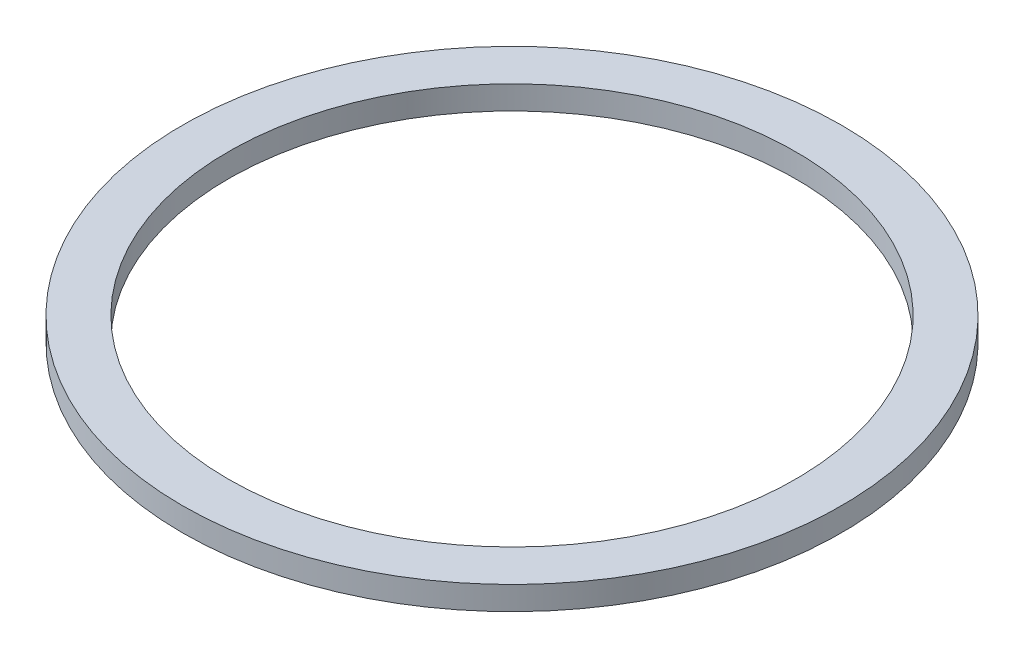
ISO-10303-21;
HEADER;
FILE_DESCRIPTION(('STEP AP214'),'2;1');
FILE_NAME('part.step','',(''),(''),'','','');
FILE_SCHEMA(('AUTOMOTIVE_DESIGN { 1 0 10303 214 1 1 1 1 }'));
ENDSEC;
DATA;
#1=APPLICATION_CONTEXT('core data for automotive mechanical design processes');
#2=APPLICATION_PROTOCOL_DEFINITION('international standard','automotive_design',2000,#1);
#3=PRODUCT_CONTEXT('',#1,'mechanical');
#4=PRODUCT('Part','Part','',(#3));
#5=PRODUCT_RELATED_PRODUCT_CATEGORY('part','',(#4));
#6=PRODUCT_DEFINITION_FORMATION('','',#4);
#7=PRODUCT_DEFINITION_CONTEXT('part definition',#1,'design');
#8=PRODUCT_DEFINITION('design','',#6,#7);
#9=PRODUCT_DEFINITION_SHAPE('','',#8);
#10=(LENGTH_UNIT() NAMED_UNIT(*) SI_UNIT(.MILLI.,.METRE.));
#11=(NAMED_UNIT(*) PLANE_ANGLE_UNIT() SI_UNIT($,.RADIAN.));
#12=(NAMED_UNIT(*) SI_UNIT($,.STERADIAN.) SOLID_ANGLE_UNIT());
#13=UNCERTAINTY_MEASURE_WITH_UNIT(LENGTH_MEASURE(1.E-05),#10,'distance_accuracy_value','');
#14=(GEOMETRIC_REPRESENTATION_CONTEXT(3) GLOBAL_UNCERTAINTY_ASSIGNED_CONTEXT((#13)) GLOBAL_UNIT_ASSIGNED_CONTEXT((#10,
#11,#12)) REPRESENTATION_CONTEXT('',''));
#15=CARTESIAN_POINT('',(0.,0.,0.));
#16=DIRECTION('',(0.,0.,1.));
#17=DIRECTION('',(1.,0.,0.));
#18=AXIS2_PLACEMENT_3D('',#15,#16,#17);
#19=CARTESIAN_POINT('',(0.,1.,0.));
#20=DIRECTION('',(0.,1.,0.));
#21=DIRECTION('',(0.,0.,1.));
#22=AXIS2_PLACEMENT_3D('',#19,#20,#21);
#23=PLANE('',#22);
#24=CARTESIAN_POINT('',(0.,1.,0.));
#25=DIRECTION('',(0.,1.,0.));
#26=DIRECTION('',(0.,0.,1.));
#27=AXIS2_PLACEMENT_3D('',#24,#25,#26);
#28=CIRCLE('',#27,14.);
#29=CARTESIAN_POINT('',(0.,1.,14.));
#30=VERTEX_POINT('',#29);
#31=EDGE_CURVE('E10',#30,#30,#28,.T.);
#32=ORIENTED_EDGE('',*,*,#31,.T.);
#33=EDGE_LOOP('',(#32));
#34=FACE_BOUND('',#33,.T.);
#35=CARTESIAN_POINT('',(0.,1.,0.));
#36=DIRECTION('',(0.,1.,0.));
#37=DIRECTION('',(0.,0.,1.));
#38=AXIS2_PLACEMENT_3D('',#35,#36,#37);
#39=CIRCLE('',#38,12.05);
#40=CARTESIAN_POINT('',(0.,1.,12.05));
#41=VERTEX_POINT('',#40);
#42=EDGE_CURVE('E41',#41,#41,#39,.T.);
#43=ORIENTED_EDGE('',*,*,#42,.F.);
#44=EDGE_LOOP('',(#43));
#45=FACE_BOUND('',#44,.T.);
#46=ADVANCED_FACE('F30',(#34,#45),#23,.T.);
#47=CARTESIAN_POINT('',(0.,0.,0.));
#48=DIRECTION('',(0.,1.,0.));
#49=DIRECTION('',(0.,0.,1.));
#50=AXIS2_PLACEMENT_3D('',#47,#48,#49);
#51=PLANE('',#50);
#52=CARTESIAN_POINT('',(0.,0.,0.));
#53=DIRECTION('',(0.,1.,0.));
#54=DIRECTION('',(0.,0.,1.));
#55=AXIS2_PLACEMENT_3D('',#52,#53,#54);
#56=CIRCLE('',#55,14.);
#57=CARTESIAN_POINT('',(0.,0.,14.));
#58=VERTEX_POINT('',#57);
#59=EDGE_CURVE('E34',#58,#58,#56,.T.);
#60=ORIENTED_EDGE('',*,*,#59,.F.);
#61=EDGE_LOOP('',(#60));
#62=FACE_BOUND('',#61,.T.);
#63=CARTESIAN_POINT('',(0.,0.,0.));
#64=DIRECTION('',(0.,1.,0.));
#65=DIRECTION('',(0.,0.,1.));
#66=AXIS2_PLACEMENT_3D('',#63,#64,#65);
#67=CIRCLE('',#66,12.05);
#68=CARTESIAN_POINT('',(0.,0.,12.05));
#69=VERTEX_POINT('',#68);
#70=EDGE_CURVE('E43',#69,#69,#67,.T.);
#71=ORIENTED_EDGE('',*,*,#70,.T.);
#72=EDGE_LOOP('',(#71));
#73=FACE_BOUND('',#72,.T.);
#74=ADVANCED_FACE('F53',(#62,#73),#51,.F.);
#75=CARTESIAN_POINT('',(0.,1.,0.));
#76=DIRECTION('',(0.,-1.,0.));
#77=DIRECTION('',(0.,0.,-1.));
#78=AXIS2_PLACEMENT_3D('',#75,#76,#77);
#79=CYLINDRICAL_SURFACE('',#78,14.);
#80=ORIENTED_EDGE('',*,*,#31,.F.);
#81=EDGE_LOOP('',(#80));
#82=FACE_BOUND('',#81,.T.);
#83=ORIENTED_EDGE('',*,*,#59,.T.);
#84=EDGE_LOOP('',(#83));
#85=FACE_BOUND('',#84,.T.);
#86=ADVANCED_FACE('F32',(#82,#85),#79,.T.);
#87=CARTESIAN_POINT('',(0.,1.,0.));
#88=DIRECTION('',(0.,-1.,0.));
#89=DIRECTION('',(0.,0.,-1.));
#90=AXIS2_PLACEMENT_3D('',#87,#88,#89);
#91=CYLINDRICAL_SURFACE('',#90,12.05);
#92=ORIENTED_EDGE('',*,*,#42,.T.);
#93=EDGE_LOOP('',(#92));
#94=FACE_BOUND('',#93,.T.);
#95=ORIENTED_EDGE('',*,*,#70,.F.);
#96=EDGE_LOOP('',(#95));
#97=FACE_BOUND('',#96,.T.);
#98=ADVANCED_FACE('F49',(#94,#97),#91,.F.);
#99=CLOSED_SHELL('',(#46,#74,#86,#98));
#100=MANIFOLD_SOLID_BREP('B2',#99);
#101=ADVANCED_BREP_SHAPE_REPRESENTATION('',(#18,#100),#14);
#102=SHAPE_DEFINITION_REPRESENTATION(#9,#101);
ENDSEC;
END-ISO-10303-21;
